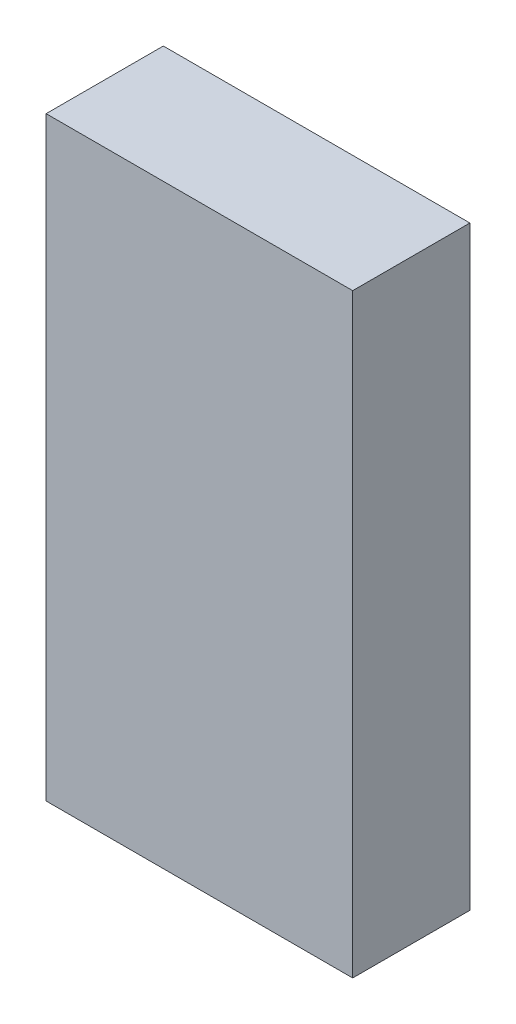
ISO-10303-21;
HEADER;
FILE_DESCRIPTION(('STEP AP214'),'2;1');
FILE_NAME('part.step','',(''),(''),'','','');
FILE_SCHEMA(('AUTOMOTIVE_DESIGN { 1 0 10303 214 1 1 1 1 }'));
ENDSEC;
DATA;
#1=APPLICATION_CONTEXT('core data for automotive mechanical design processes');
#2=APPLICATION_PROTOCOL_DEFINITION('international standard','automotive_design',2000,#1);
#3=PRODUCT_CONTEXT('',#1,'mechanical');
#4=PRODUCT('Part','Part','',(#3));
#5=PRODUCT_RELATED_PRODUCT_CATEGORY('part','',(#4));
#6=PRODUCT_DEFINITION_FORMATION('','',#4);
#7=PRODUCT_DEFINITION_CONTEXT('part definition',#1,'design');
#8=PRODUCT_DEFINITION('design','',#6,#7);
#9=PRODUCT_DEFINITION_SHAPE('','',#8);
#10=(LENGTH_UNIT() NAMED_UNIT(*) SI_UNIT(.MILLI.,.METRE.));
#11=(NAMED_UNIT(*) PLANE_ANGLE_UNIT() SI_UNIT($,.RADIAN.));
#12=(NAMED_UNIT(*) SI_UNIT($,.STERADIAN.) SOLID_ANGLE_UNIT());
#13=UNCERTAINTY_MEASURE_WITH_UNIT(LENGTH_MEASURE(1.E-05),#10,'distance_accuracy_value','');
#14=(GEOMETRIC_REPRESENTATION_CONTEXT(3) GLOBAL_UNCERTAINTY_ASSIGNED_CONTEXT((#13)) GLOBAL_UNIT_ASSIGNED_CONTEXT((#10,
#11,#12)) REPRESENTATION_CONTEXT('',''));
#15=CARTESIAN_POINT('',(0.,0.,0.));
#16=DIRECTION('',(0.,0.,1.));
#17=DIRECTION('',(1.,0.,0.));
#18=AXIS2_PLACEMENT_3D('',#15,#16,#17);
#19=CARTESIAN_POINT('',(-1.3462,-2.54,1.));
#20=DIRECTION('',(1.,0.,0.));
#21=DIRECTION('',(0.,0.,-1.));
#22=AXIS2_PLACEMENT_3D('',#19,#20,#21);
#23=PLANE('',#22);
#24=DIRECTION('',(0.,-1.,0.));
#25=VECTOR('',#24,1.);
#26=CARTESIAN_POINT('',(-1.3462,-2.54,0.));
#27=LINE('',#26,#25);
#28=CARTESIAN_POINT('',(-1.3462,2.54,0.));
#29=VERTEX_POINT('',#28);
#30=CARTESIAN_POINT('',(-1.3462,-2.54,0.));
#31=VERTEX_POINT('',#30);
#32=EDGE_CURVE('E96',#29,#31,#27,.T.);
#33=ORIENTED_EDGE('',*,*,#32,.T.);
#34=DIRECTION('',(0.,0.,-1.));
#35=VECTOR('',#34,1.);
#36=CARTESIAN_POINT('',(-1.3462,-2.54,1.));
#37=LINE('',#36,#35);
#38=CARTESIAN_POINT('',(-1.3462,-2.54,1.));
#39=VERTEX_POINT('',#38);
#40=EDGE_CURVE('E11',#39,#31,#37,.T.);
#41=ORIENTED_EDGE('',*,*,#40,.F.);
#42=DIRECTION('',(0.,-1.,0.));
#43=VECTOR('',#42,1.);
#44=CARTESIAN_POINT('',(-1.3462,-2.54,1.));
#45=LINE('',#44,#43);
#46=CARTESIAN_POINT('',(-1.3462,2.54,1.));
#47=VERTEX_POINT('',#46);
#48=EDGE_CURVE('E84',#47,#39,#45,.T.);
#49=ORIENTED_EDGE('',*,*,#48,.F.);
#50=DIRECTION('',(0.,0.,-1.));
#51=VECTOR('',#50,1.);
#52=CARTESIAN_POINT('',(-1.3462,2.54,1.));
#53=LINE('',#52,#51);
#54=EDGE_CURVE('E92',#47,#29,#53,.T.);
#55=ORIENTED_EDGE('',*,*,#54,.T.);
#56=EDGE_LOOP('',(#33,#41,#49,#55));
#57=FACE_BOUND('',#56,.T.);
#58=ADVANCED_FACE('F33',(#57),#23,.F.);
#59=CARTESIAN_POINT('',(1.27,-2.54,1.));
#60=DIRECTION('',(0.,1.,0.));
#61=DIRECTION('',(0.,0.,1.));
#62=AXIS2_PLACEMENT_3D('',#59,#60,#61);
#63=PLANE('',#62);
#64=DIRECTION('',(1.,0.,0.));
#65=VECTOR('',#64,1.);
#66=CARTESIAN_POINT('',(1.27,-2.54,0.));
#67=LINE('',#66,#65);
#68=CARTESIAN_POINT('',(1.27,-2.54,0.));
#69=VERTEX_POINT('',#68);
#70=EDGE_CURVE('E88',#31,#69,#67,.T.);
#71=ORIENTED_EDGE('',*,*,#70,.T.);
#72=DIRECTION('',(0.,0.,-1.));
#73=VECTOR('',#72,1.);
#74=CARTESIAN_POINT('',(1.27,-2.54,1.));
#75=LINE('',#74,#73);
#76=CARTESIAN_POINT('',(1.27,-2.54,1.));
#77=VERTEX_POINT('',#76);
#78=EDGE_CURVE('E41',#77,#69,#75,.T.);
#79=ORIENTED_EDGE('',*,*,#78,.F.);
#80=DIRECTION('',(1.,0.,0.));
#81=VECTOR('',#80,1.);
#82=CARTESIAN_POINT('',(1.27,-2.54,1.));
#83=LINE('',#82,#81);
#84=EDGE_CURVE('E79',#39,#77,#83,.T.);
#85=ORIENTED_EDGE('',*,*,#84,.F.);
#86=ORIENTED_EDGE('',*,*,#40,.T.);
#87=EDGE_LOOP('',(#71,#79,#85,#86));
#88=FACE_BOUND('',#87,.T.);
#89=ADVANCED_FACE('F87',(#88),#63,.F.);
#90=CARTESIAN_POINT('',(1.27,2.54,1.));
#91=DIRECTION('',(-1.,0.,0.));
#92=DIRECTION('',(0.,0.,1.));
#93=AXIS2_PLACEMENT_3D('',#90,#91,#92);
#94=PLANE('',#93);
#95=DIRECTION('',(0.,1.,0.));
#96=VECTOR('',#95,1.);
#97=CARTESIAN_POINT('',(1.27,2.54,0.));
#98=LINE('',#97,#96);
#99=CARTESIAN_POINT('',(1.27,2.54,0.));
#100=VERTEX_POINT('',#99);
#101=EDGE_CURVE('E66',#69,#100,#98,.T.);
#102=ORIENTED_EDGE('',*,*,#101,.T.);
#103=DIRECTION('',(0.,0.,-1.));
#104=VECTOR('',#103,1.);
#105=CARTESIAN_POINT('',(1.27,2.54,1.));
#106=LINE('',#105,#104);
#107=CARTESIAN_POINT('',(1.27,2.54,1.));
#108=VERTEX_POINT('',#107);
#109=EDGE_CURVE('E89',#108,#100,#106,.T.);
#110=ORIENTED_EDGE('',*,*,#109,.F.);
#111=DIRECTION('',(0.,1.,0.));
#112=VECTOR('',#111,1.);
#113=CARTESIAN_POINT('',(1.27,2.54,1.));
#114=LINE('',#113,#112);
#115=EDGE_CURVE('E82',#77,#108,#114,.T.);
#116=ORIENTED_EDGE('',*,*,#115,.F.);
#117=ORIENTED_EDGE('',*,*,#78,.T.);
#118=EDGE_LOOP('',(#102,#110,#116,#117));
#119=FACE_BOUND('',#118,.T.);
#120=ADVANCED_FACE('F90',(#119),#94,.F.);
#121=CARTESIAN_POINT('',(-1.3462,2.54,1.));
#122=DIRECTION('',(0.,-1.,0.));
#123=DIRECTION('',(0.,0.,-1.));
#124=AXIS2_PLACEMENT_3D('',#121,#122,#123);
#125=PLANE('',#124);
#126=DIRECTION('',(-1.,0.,0.));
#127=VECTOR('',#126,1.);
#128=CARTESIAN_POINT('',(-1.3462,2.54,0.));
#129=LINE('',#128,#127);
#130=EDGE_CURVE('E72',#100,#29,#129,.T.);
#131=ORIENTED_EDGE('',*,*,#130,.T.);
#132=ORIENTED_EDGE('',*,*,#54,.F.);
#133=DIRECTION('',(-1.,0.,0.));
#134=VECTOR('',#133,1.);
#135=CARTESIAN_POINT('',(-1.3462,2.54,1.));
#136=LINE('',#135,#134);
#137=EDGE_CURVE('E49',#108,#47,#136,.T.);
#138=ORIENTED_EDGE('',*,*,#137,.F.);
#139=ORIENTED_EDGE('',*,*,#109,.T.);
#140=EDGE_LOOP('',(#131,#132,#138,#139));
#141=FACE_BOUND('',#140,.T.);
#142=ADVANCED_FACE('F103',(#141),#125,.F.);
#143=CARTESIAN_POINT('',(0.,0.,1.));
#144=DIRECTION('',(0.,0.,-1.));
#145=DIRECTION('',(-1.,0.,0.));
#146=AXIS2_PLACEMENT_3D('',#143,#144,#145);
#147=PLANE('',#146);
#148=ORIENTED_EDGE('',*,*,#48,.T.);
#149=ORIENTED_EDGE('',*,*,#84,.T.);
#150=ORIENTED_EDGE('',*,*,#115,.T.);
#151=ORIENTED_EDGE('',*,*,#137,.T.);
#152=EDGE_LOOP('',(#148,#149,#150,#151));
#153=FACE_BOUND('',#152,.T.);
#154=ADVANCED_FACE('F80',(#153),#147,.F.);
#155=CARTESIAN_POINT('',(0.,0.,0.));
#156=DIRECTION('',(0.,0.,-1.));
#157=DIRECTION('',(-1.,0.,0.));
#158=AXIS2_PLACEMENT_3D('',#155,#156,#157);
#159=PLANE('',#158);
#160=ORIENTED_EDGE('',*,*,#32,.F.);
#161=ORIENTED_EDGE('',*,*,#130,.F.);
#162=ORIENTED_EDGE('',*,*,#101,.F.);
#163=ORIENTED_EDGE('',*,*,#70,.F.);
#164=EDGE_LOOP('',(#160,#161,#162,#163));
#165=FACE_BOUND('',#164,.T.);
#166=ADVANCED_FACE('F106',(#165),#159,.T.);
#167=CLOSED_SHELL('',(#58,#89,#120,#142,#154,#166));
#168=MANIFOLD_SOLID_BREP('B2',#167);
#169=ADVANCED_BREP_SHAPE_REPRESENTATION('',(#18,#168),#14);
#170=SHAPE_DEFINITION_REPRESENTATION(#9,#169);
ENDSEC;
END-ISO-10303-21;
